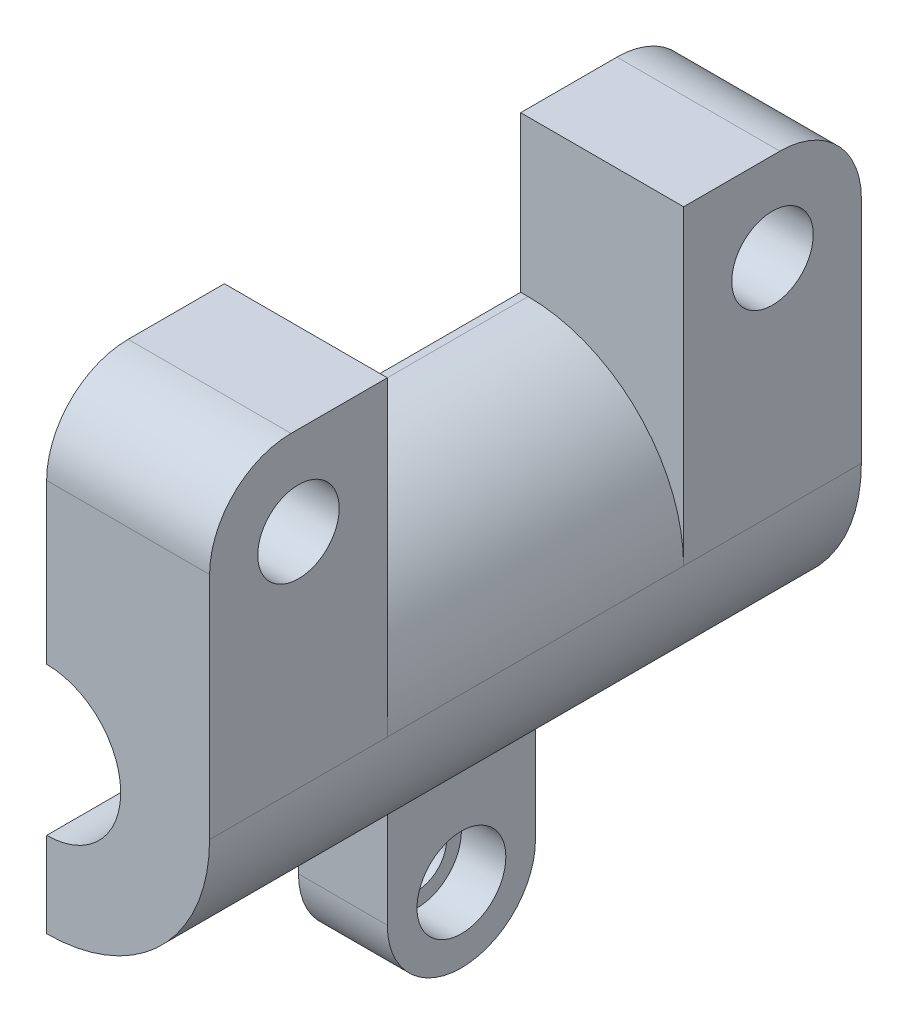
ISO-10303-21;
HEADER;
FILE_DESCRIPTION(('STEP AP214'),'2;1');
FILE_NAME('part.step','',(''),(''),'','','');
FILE_SCHEMA(('AUTOMOTIVE_DESIGN { 1 0 10303 214 1 1 1 1 }'));
ENDSEC;
DATA;
#1=APPLICATION_CONTEXT('core data for automotive mechanical design processes');
#2=APPLICATION_PROTOCOL_DEFINITION('international standard','automotive_design',2000,#1);
#3=PRODUCT_CONTEXT('',#1,'mechanical');
#4=PRODUCT('Part','Part','',(#3));
#5=PRODUCT_RELATED_PRODUCT_CATEGORY('part','',(#4));
#6=PRODUCT_DEFINITION_FORMATION('','',#4);
#7=PRODUCT_DEFINITION_CONTEXT('part definition',#1,'design');
#8=PRODUCT_DEFINITION('design','',#6,#7);
#9=PRODUCT_DEFINITION_SHAPE('','',#8);
#10=(LENGTH_UNIT() NAMED_UNIT(*) SI_UNIT(.MILLI.,.METRE.));
#11=(NAMED_UNIT(*) PLANE_ANGLE_UNIT() SI_UNIT($,.RADIAN.));
#12=(NAMED_UNIT(*) SI_UNIT($,.STERADIAN.) SOLID_ANGLE_UNIT());
#13=UNCERTAINTY_MEASURE_WITH_UNIT(LENGTH_MEASURE(1.E-05),#10,'distance_accuracy_value','');
#14=(GEOMETRIC_REPRESENTATION_CONTEXT(3) GLOBAL_UNCERTAINTY_ASSIGNED_CONTEXT((#13)) GLOBAL_UNIT_ASSIGNED_CONTEXT((#10,
#11,#12)) REPRESENTATION_CONTEXT('',''));
#15=CARTESIAN_POINT('',(0.,0.,0.));
#16=DIRECTION('',(0.,0.,1.));
#17=DIRECTION('',(1.,0.,0.));
#18=AXIS2_PLACEMENT_3D('',#15,#16,#17);
#19=CARTESIAN_POINT('',(11.,0.,0.));
#20=DIRECTION('',(-1.,0.,0.));
#21=DIRECTION('',(0.,0.,1.));
#22=AXIS2_PLACEMENT_3D('',#19,#20,#21);
#23=PLANE('',#22);
#24=CARTESIAN_POINT('',(11.,10.,16.));
#25=DIRECTION('',(1.,0.,0.));
#26=DIRECTION('',(0.,0.,-1.));
#27=AXIS2_PLACEMENT_3D('',#24,#25,#26);
#28=CIRCLE('',#27,2.75);
#29=CARTESIAN_POINT('',(11.,10.,13.25));
#30=VERTEX_POINT('',#29);
#31=EDGE_CURVE('E450',#30,#30,#28,.T.);
#32=ORIENTED_EDGE('',*,*,#31,.F.);
#33=EDGE_LOOP('',(#32));
#34=FACE_BOUND('',#33,.T.);
#35=DIRECTION('',(0.,-1.,0.));
#36=VECTOR('',#35,1.);
#37=CARTESIAN_POINT('',(11.,-16.,22.));
#38=LINE('',#37,#36);
#39=CARTESIAN_POINT('',(11.,10.5,22.));
#40=VERTEX_POINT('',#39);
#41=CARTESIAN_POINT('',(11.,-5.,22.));
#42=VERTEX_POINT('',#41);
#43=EDGE_CURVE('E233',#40,#42,#38,.T.);
#44=ORIENTED_EDGE('',*,*,#43,.T.);
#45=DIRECTION('',(0.,0.,-1.));
#46=VECTOR('',#45,1.);
#47=CARTESIAN_POINT('',(11.,-5.,0.));
#48=LINE('',#47,#46);
#49=CARTESIAN_POINT('',(11.,-4.99999999999999,9.99999999999999));
#50=VERTEX_POINT('',#49);
#51=EDGE_CURVE('E320',#42,#50,#48,.T.);
#52=ORIENTED_EDGE('',*,*,#51,.T.);
#53=DIRECTION('',(0.,-1.,0.));
#54=VECTOR('',#53,1.);
#55=CARTESIAN_POINT('',(11.,16.,10.));
#56=LINE('',#55,#54);
#57=CARTESIAN_POINT('',(11.,16.,10.));
#58=VERTEX_POINT('',#57);
#59=EDGE_CURVE('E429',#58,#50,#56,.T.);
#60=ORIENTED_EDGE('',*,*,#59,.F.);
#61=DIRECTION('',(0.,0.,1.));
#62=VECTOR('',#61,1.);
#63=CARTESIAN_POINT('',(11.,16.,22.));
#64=LINE('',#63,#62);
#65=CARTESIAN_POINT('',(11.,16.,16.5));
#66=VERTEX_POINT('',#65);
#67=EDGE_CURVE('E222',#58,#66,#64,.T.);
#68=ORIENTED_EDGE('',*,*,#67,.T.);
#69=CARTESIAN_POINT('',(11.,10.5,16.5));
#70=DIRECTION('',(-1.,0.,0.));
#71=DIRECTION('',(0.,0.,1.));
#72=AXIS2_PLACEMENT_3D('',#69,#70,#71);
#73=CIRCLE('',#72,5.5);
#74=EDGE_CURVE('E266',#66,#40,#73,.F.);
#75=ORIENTED_EDGE('',*,*,#74,.T.);
#76=EDGE_LOOP('',(#44,#52,#60,#68,#75));
#77=FACE_BOUND('',#76,.T.);
#78=ADVANCED_FACE('F39',(#34,#77),#23,.F.);
#79=CARTESIAN_POINT('',(6.,-21.,0.));
#80=DIRECTION('',(-1.,0.,0.));
#81=DIRECTION('',(0.,0.,1.));
#82=AXIS2_PLACEMENT_3D('',#79,#80,#81);
#83=CYLINDRICAL_SURFACE('',#82,2.);
#84=CARTESIAN_POINT('',(0.,-21.,0.));
#85=DIRECTION('',(1.,0.,0.));
#86=DIRECTION('',(0.,0.,-1.));
#87=AXIS2_PLACEMENT_3D('',#84,#85,#86);
#88=CIRCLE('',#87,2.);
#89=CARTESIAN_POINT('',(0.,-21.,-2.));
#90=VERTEX_POINT('',#89);
#91=EDGE_CURVE('E302',#90,#90,#88,.T.);
#92=ORIENTED_EDGE('',*,*,#91,.F.);
#93=EDGE_LOOP('',(#92));
#94=FACE_BOUND('',#93,.T.);
#95=CARTESIAN_POINT('',(3.,-21.,0.));
#96=DIRECTION('',(1.,0.,0.));
#97=DIRECTION('',(0.,0.,-1.));
#98=AXIS2_PLACEMENT_3D('',#95,#96,#97);
#99=CIRCLE('',#98,2.);
#100=CARTESIAN_POINT('',(3.,-21.,-2.));
#101=VERTEX_POINT('',#100);
#102=EDGE_CURVE('E468',#101,#101,#99,.T.);
#103=ORIENTED_EDGE('',*,*,#102,.T.);
#104=EDGE_LOOP('',(#103));
#105=FACE_BOUND('',#104,.T.);
#106=ADVANCED_FACE('F476',(#94,#105),#83,.F.);
#107=CARTESIAN_POINT('',(11.,16.,22.));
#108=DIRECTION('',(0.,-1.,0.));
#109=DIRECTION('',(0.,0.,-1.));
#110=AXIS2_PLACEMENT_3D('',#107,#108,#109);
#111=PLANE('',#110);
#112=DIRECTION('',(0.,0.,1.));
#113=VECTOR('',#112,1.);
#114=CARTESIAN_POINT('',(0.,16.,22.));
#115=LINE('',#114,#113);
#116=CARTESIAN_POINT('',(0.,16.,10.));
#117=VERTEX_POINT('',#116);
#118=CARTESIAN_POINT('',(0.,16.,16.5));
#119=VERTEX_POINT('',#118);
#120=EDGE_CURVE('E350',#117,#119,#115,.T.);
#121=ORIENTED_EDGE('',*,*,#120,.T.);
#122=DIRECTION('',(-1.,0.,0.));
#123=VECTOR('',#122,1.);
#124=CARTESIAN_POINT('',(11.,16.,16.5));
#125=LINE('',#124,#123);
#126=EDGE_CURVE('E276',#119,#66,#125,.F.);
#127=ORIENTED_EDGE('',*,*,#126,.T.);
#128=ORIENTED_EDGE('',*,*,#67,.F.);
#129=DIRECTION('',(1.,0.,0.));
#130=VECTOR('',#129,1.);
#131=CARTESIAN_POINT('',(0.,16.,10.));
#132=LINE('',#131,#130);
#133=EDGE_CURVE('E420',#117,#58,#132,.T.);
#134=ORIENTED_EDGE('',*,*,#133,.F.);
#135=EDGE_LOOP('',(#121,#127,#128,#134));
#136=FACE_BOUND('',#135,.T.);
#137=ADVANCED_FACE('F512',(#136),#111,.F.);
#138=CARTESIAN_POINT('',(0.,0.,0.));
#139=DIRECTION('',(-1.,0.,0.));
#140=DIRECTION('',(0.,0.,1.));
#141=AXIS2_PLACEMENT_3D('',#138,#139,#140);
#142=PLANE('',#141);
#143=DIRECTION('',(0.,1.,0.));
#144=VECTOR('',#143,1.);
#145=CARTESIAN_POINT('',(0.,-16.,-5.));
#146=LINE('',#145,#144);
#147=CARTESIAN_POINT('',(0.,-21.,-5.));
#148=VERTEX_POINT('',#147);
#149=CARTESIAN_POINT('',(0.,-16.,-5.));
#150=VERTEX_POINT('',#149);
#151=EDGE_CURVE('E211',#148,#150,#146,.T.);
#152=ORIENTED_EDGE('',*,*,#151,.F.);
#153=CARTESIAN_POINT('',(0.,-21.,0.));
#154=DIRECTION('',(-1.,0.,0.));
#155=DIRECTION('',(0.,0.,1.));
#156=AXIS2_PLACEMENT_3D('',#153,#154,#155);
#157=CIRCLE('',#156,5.);
#158=CARTESIAN_POINT('',(0.,-26.,0.));
#159=VERTEX_POINT('',#158);
#160=EDGE_CURVE('E285',#148,#159,#157,.T.);
#161=ORIENTED_EDGE('',*,*,#160,.T.);
#162=CARTESIAN_POINT('',(0.,-21.,0.));
#163=DIRECTION('',(-1.,0.,0.));
#164=DIRECTION('',(0.,0.,1.));
#165=AXIS2_PLACEMENT_3D('',#162,#163,#164);
#166=CIRCLE('',#165,5.);
#167=CARTESIAN_POINT('',(0.,-21.,5.));
#168=VERTEX_POINT('',#167);
#169=EDGE_CURVE('E209',#159,#168,#166,.T.);
#170=ORIENTED_EDGE('',*,*,#169,.T.);
#171=DIRECTION('',(0.,-1.,0.));
#172=VECTOR('',#171,1.);
#173=CARTESIAN_POINT('',(0.,-16.,5.));
#174=LINE('',#173,#172);
#175=CARTESIAN_POINT('',(0.,-16.,5.));
#176=VERTEX_POINT('',#175);
#177=EDGE_CURVE('E195',#176,#168,#174,.T.);
#178=ORIENTED_EDGE('',*,*,#177,.F.);
#179=DIRECTION('',(0.,0.,-1.));
#180=VECTOR('',#179,1.);
#181=CARTESIAN_POINT('',(0.,-16.,22.));
#182=LINE('',#181,#180);
#183=CARTESIAN_POINT('',(0.,-16.,22.));
#184=VERTEX_POINT('',#183);
#185=EDGE_CURVE('E206',#184,#176,#182,.T.);
#186=ORIENTED_EDGE('',*,*,#185,.F.);
#187=DIRECTION('',(0.,-1.,0.));
#188=VECTOR('',#187,1.);
#189=CARTESIAN_POINT('',(0.,-16.,22.));
#190=LINE('',#189,#188);
#191=CARTESIAN_POINT('',(0.,-10.25,22.));
#192=VERTEX_POINT('',#191);
#193=EDGE_CURVE('E362',#192,#184,#190,.T.);
#194=ORIENTED_EDGE('',*,*,#193,.F.);
#195=DIRECTION('',(0.,0.,1.));
#196=VECTOR('',#195,1.);
#197=CARTESIAN_POINT('',(0.,-10.25,-22.));
#198=LINE('',#197,#196);
#199=CARTESIAN_POINT('',(0.,-10.25,12.25));
#200=VERTEX_POINT('',#199);
#201=EDGE_CURVE('E249',#200,#192,#198,.T.);
#202=ORIENTED_EDGE('',*,*,#201,.F.);
#203=DIRECTION('',(0.,1.,0.));
#204=VECTOR('',#203,1.);
#205=CARTESIAN_POINT('',(0.,-13.,12.25));
#206=LINE('',#205,#204);
#207=CARTESIAN_POINT('',(0.,-13.,12.25));
#208=VERTEX_POINT('',#207);
#209=EDGE_CURVE('E571',#208,#200,#206,.T.);
#210=ORIENTED_EDGE('',*,*,#209,.F.);
#211=DIRECTION('',(0.,0.,1.));
#212=VECTOR('',#211,1.);
#213=CARTESIAN_POINT('',(0.,-13.,-12.25));
#214=LINE('',#213,#212);
#215=CARTESIAN_POINT('',(0.,-13.,-12.25));
#216=VERTEX_POINT('',#215);
#217=EDGE_CURVE('E567',#216,#208,#214,.T.);
#218=ORIENTED_EDGE('',*,*,#217,.F.);
#219=DIRECTION('',(0.,1.,0.));
#220=VECTOR('',#219,1.);
#221=CARTESIAN_POINT('',(0.,-13.,-12.25));
#222=LINE('',#221,#220);
#223=CARTESIAN_POINT('',(0.,-10.25,-12.25));
#224=VERTEX_POINT('',#223);
#225=EDGE_CURVE('E358',#216,#224,#222,.T.);
#226=ORIENTED_EDGE('',*,*,#225,.T.);
#227=CARTESIAN_POINT('',(0.,-10.25,-22.));
#228=VERTEX_POINT('',#227);
#229=EDGE_CURVE('E346',#228,#224,#198,.T.);
#230=ORIENTED_EDGE('',*,*,#229,.F.);
#231=DIRECTION('',(0.,1.,0.));
#232=VECTOR('',#231,1.);
#233=CARTESIAN_POINT('',(0.,-16.,-22.));
#234=LINE('',#233,#232);
#235=CARTESIAN_POINT('',(0.,-16.,-22.));
#236=VERTEX_POINT('',#235);
#237=EDGE_CURVE('E344',#236,#228,#234,.T.);
#238=ORIENTED_EDGE('',*,*,#237,.F.);
#239=EDGE_CURVE('E218',#150,#236,#182,.T.);
#240=ORIENTED_EDGE('',*,*,#239,.F.);
#241=EDGE_LOOP('',(#152,#161,#170,#178,#186,#194,#202,#210,#218,#226,#230,#238,#240));
#242=FACE_BOUND('',#241,.T.);
#243=ORIENTED_EDGE('',*,*,#91,.T.);
#244=EDGE_LOOP('',(#243));
#245=FACE_BOUND('',#244,.T.);
#246=ADVANCED_FACE('F203',(#242,#245),#142,.T.);
#247=CARTESIAN_POINT('',(0.,10.,16.));
#248=DIRECTION('',(1.,0.,0.));
#249=DIRECTION('',(0.,0.,-1.));
#250=AXIS2_PLACEMENT_3D('',#247,#248,#249);
#251=CIRCLE('',#250,2.75);
#252=CARTESIAN_POINT('',(0.,10.,13.25));
#253=VERTEX_POINT('',#252);
#254=EDGE_CURVE('E386',#253,#253,#251,.T.);
#255=ORIENTED_EDGE('',*,*,#254,.T.);
#256=EDGE_LOOP('',(#255));
#257=FACE_BOUND('',#256,.T.);
#258=CARTESIAN_POINT('',(0.,10.,-16.));
#259=DIRECTION('',(1.,0.,0.));
#260=DIRECTION('',(0.,0.,-1.));
#261=AXIS2_PLACEMENT_3D('',#258,#259,#260);
#262=CIRCLE('',#261,2.75);
#263=CARTESIAN_POINT('',(0.,10.,-18.75));
#264=VERTEX_POINT('',#263);
#265=EDGE_CURVE('E446',#264,#264,#262,.T.);
#266=ORIENTED_EDGE('',*,*,#265,.T.);
#267=EDGE_LOOP('',(#266));
#268=FACE_BOUND('',#267,.T.);
#269=CARTESIAN_POINT('',(0.,16.,-16.5));
#270=VERTEX_POINT('',#269);
#271=CARTESIAN_POINT('',(0.,16.,-10.));
#272=VERTEX_POINT('',#271);
#273=EDGE_CURVE('E356',#270,#272,#115,.T.);
#274=ORIENTED_EDGE('',*,*,#273,.F.);
#275=CARTESIAN_POINT('',(0.,10.5,-16.5));
#276=DIRECTION('',(-1.,0.,0.));
#277=DIRECTION('',(0.,0.,1.));
#278=AXIS2_PLACEMENT_3D('',#275,#276,#277);
#279=CIRCLE('',#278,5.5);
#280=CARTESIAN_POINT('',(0.,10.5,-22.));
#281=VERTEX_POINT('',#280);
#282=EDGE_CURVE('E259',#270,#281,#279,.T.);
#283=ORIENTED_EDGE('',*,*,#282,.T.);
#284=CARTESIAN_POINT('',(0.,-0.249999999999999,-22.));
#285=VERTEX_POINT('',#284);
#286=EDGE_CURVE('E351',#285,#281,#234,.T.);
#287=ORIENTED_EDGE('',*,*,#286,.F.);
#288=DIRECTION('',(0.,0.,1.));
#289=VECTOR('',#288,1.);
#290=CARTESIAN_POINT('',(0.,-0.249999999999999,-22.));
#291=LINE('',#290,#289);
#292=CARTESIAN_POINT('',(0.,-0.249999999999999,-12.25));
#293=VERTEX_POINT('',#292);
#294=EDGE_CURVE('E395',#293,#285,#291,.F.);
#295=ORIENTED_EDGE('',*,*,#294,.F.);
#296=CARTESIAN_POINT('',(0.,2.5,-12.25));
#297=VERTEX_POINT('',#296);
#298=EDGE_CURVE('E566',#293,#297,#222,.T.);
#299=ORIENTED_EDGE('',*,*,#298,.T.);
#300=DIRECTION('',(0.,0.,1.));
#301=VECTOR('',#300,1.);
#302=CARTESIAN_POINT('',(0.,2.5,-12.25));
#303=LINE('',#302,#301);
#304=CARTESIAN_POINT('',(0.,2.5,12.25));
#305=VERTEX_POINT('',#304);
#306=EDGE_CURVE('E248',#297,#305,#303,.T.);
#307=ORIENTED_EDGE('',*,*,#306,.T.);
#308=CARTESIAN_POINT('',(0.,-0.249999999999999,12.25));
#309=VERTEX_POINT('',#308);
#310=EDGE_CURVE('E391',#309,#305,#206,.T.);
#311=ORIENTED_EDGE('',*,*,#310,.F.);
#312=CARTESIAN_POINT('',(0.,-0.249999999999999,22.));
#313=VERTEX_POINT('',#312);
#314=EDGE_CURVE('E381',#313,#309,#291,.F.);
#315=ORIENTED_EDGE('',*,*,#314,.F.);
#316=CARTESIAN_POINT('',(0.,10.5,22.));
#317=VERTEX_POINT('',#316);
#318=EDGE_CURVE('E225',#317,#313,#190,.T.);
#319=ORIENTED_EDGE('',*,*,#318,.F.);
#320=CARTESIAN_POINT('',(0.,10.5,16.5));
#321=DIRECTION('',(-1.,0.,0.));
#322=DIRECTION('',(0.,0.,1.));
#323=AXIS2_PLACEMENT_3D('',#320,#321,#322);
#324=CIRCLE('',#323,5.5);
#325=EDGE_CURVE('E256',#317,#119,#324,.T.);
#326=ORIENTED_EDGE('',*,*,#325,.T.);
#327=ORIENTED_EDGE('',*,*,#120,.F.);
#328=DIRECTION('',(0.,-1.,0.));
#329=VECTOR('',#328,1.);
#330=CARTESIAN_POINT('',(0.,16.,10.));
#331=LINE('',#330,#329);
#332=CARTESIAN_POINT('',(0.,5.5,10.));
#333=VERTEX_POINT('',#332);
#334=EDGE_CURVE('E428',#117,#333,#331,.T.);
#335=ORIENTED_EDGE('',*,*,#334,.T.);
#336=DIRECTION('',(0.,0.,-1.));
#337=VECTOR('',#336,1.);
#338=CARTESIAN_POINT('',(0.,5.5,10.));
#339=LINE('',#338,#337);
#340=CARTESIAN_POINT('',(0.,5.5,-10.));
#341=VERTEX_POINT('',#340);
#342=EDGE_CURVE('E436',#333,#341,#339,.T.);
#343=ORIENTED_EDGE('',*,*,#342,.T.);
#344=DIRECTION('',(0.,1.,0.));
#345=VECTOR('',#344,1.);
#346=CARTESIAN_POINT('',(0.,16.,-10.));
#347=LINE('',#346,#345);
#348=EDGE_CURVE('E413',#341,#272,#347,.T.);
#349=ORIENTED_EDGE('',*,*,#348,.T.);
#350=EDGE_LOOP('',(#274,#283,#287,#295,#299,#307,#311,#315,#319,#326,#327,#335,#343,#349));
#351=FACE_BOUND('',#350,.T.);
#352=ADVANCED_FACE('F389',(#257,#268,#351),#142,.T.);
#353=CARTESIAN_POINT('',(11.,-16.,-22.));
#354=DIRECTION('',(0.,0.,1.));
#355=DIRECTION('',(1.,0.,0.));
#356=AXIS2_PLACEMENT_3D('',#353,#354,#355);
#357=PLANE('',#356);
#358=DIRECTION('',(0.,1.,0.));
#359=VECTOR('',#358,1.);
#360=CARTESIAN_POINT('',(11.,-16.,-22.));
#361=LINE('',#360,#359);
#362=CARTESIAN_POINT('',(11.,-5.,-22.));
#363=VERTEX_POINT('',#362);
#364=CARTESIAN_POINT('',(11.,10.5,-22.));
#365=VERTEX_POINT('',#364);
#366=EDGE_CURVE('E217',#363,#365,#361,.T.);
#367=ORIENTED_EDGE('',*,*,#366,.F.);
#368=CARTESIAN_POINT('',(0.,-5.,-22.));
#369=DIRECTION('',(0.,0.,1.));
#370=DIRECTION('',(1.,0.,0.));
#371=AXIS2_PLACEMENT_3D('',#368,#369,#370);
#372=CIRCLE('',#371,11.);
#373=EDGE_CURVE('E324',#363,#236,#372,.F.);
#374=ORIENTED_EDGE('',*,*,#373,.T.);
#375=ORIENTED_EDGE('',*,*,#237,.T.);
#376=CARTESIAN_POINT('',(0.,-5.25,-22.));
#377=DIRECTION('',(0.,0.,1.));
#378=DIRECTION('',(1.,0.,0.));
#379=AXIS2_PLACEMENT_3D('',#376,#377,#378);
#380=CIRCLE('',#379,5.);
#381=EDGE_CURVE('E385',#228,#285,#380,.T.);
#382=ORIENTED_EDGE('',*,*,#381,.T.);
#383=ORIENTED_EDGE('',*,*,#286,.T.);
#384=DIRECTION('',(-1.,0.,0.));
#385=VECTOR('',#384,1.);
#386=CARTESIAN_POINT('',(11.,10.5,-22.));
#387=LINE('',#386,#385);
#388=EDGE_CURVE('E262',#281,#365,#387,.F.);
#389=ORIENTED_EDGE('',*,*,#388,.T.);
#390=EDGE_LOOP('',(#367,#374,#375,#382,#383,#389));
#391=FACE_BOUND('',#390,.T.);
#392=ADVANCED_FACE('F542',(#391),#357,.F.);
#393=CARTESIAN_POINT('',(11.,16.,-16.5));
#394=VERTEX_POINT('',#393);
#395=CARTESIAN_POINT('',(11.,16.,-10.));
#396=VERTEX_POINT('',#395);
#397=EDGE_CURVE('E534',#394,#396,#64,.T.);
#398=ORIENTED_EDGE('',*,*,#397,.F.);
#399=DIRECTION('',(-1.,0.,0.));
#400=VECTOR('',#399,1.);
#401=CARTESIAN_POINT('',(11.,16.,-16.5));
#402=LINE('',#401,#400);
#403=EDGE_CURVE('E252',#394,#270,#402,.T.);
#404=ORIENTED_EDGE('',*,*,#403,.T.);
#405=ORIENTED_EDGE('',*,*,#273,.T.);
#406=DIRECTION('',(1.,0.,0.));
#407=VECTOR('',#406,1.);
#408=CARTESIAN_POINT('',(0.,16.,-10.));
#409=LINE('',#408,#407);
#410=EDGE_CURVE('E417',#272,#396,#409,.T.);
#411=ORIENTED_EDGE('',*,*,#410,.T.);
#412=EDGE_LOOP('',(#398,#404,#405,#411));
#413=FACE_BOUND('',#412,.T.);
#414=ADVANCED_FACE('F527',(#413),#111,.F.);
#415=CARTESIAN_POINT('',(11.,-16.,22.));
#416=DIRECTION('',(0.,0.,-1.));
#417=DIRECTION('',(-1.,0.,0.));
#418=AXIS2_PLACEMENT_3D('',#415,#416,#417);
#419=PLANE('',#418);
#420=ORIENTED_EDGE('',*,*,#193,.T.);
#421=CARTESIAN_POINT('',(0.,-5.,22.));
#422=DIRECTION('',(0.,0.,-1.));
#423=DIRECTION('',(-1.,0.,0.));
#424=AXIS2_PLACEMENT_3D('',#421,#422,#423);
#425=CIRCLE('',#424,11.);
#426=EDGE_CURVE('E215',#184,#42,#425,.F.);
#427=ORIENTED_EDGE('',*,*,#426,.T.);
#428=ORIENTED_EDGE('',*,*,#43,.F.);
#429=DIRECTION('',(-1.,0.,0.));
#430=VECTOR('',#429,1.);
#431=CARTESIAN_POINT('',(11.,10.5,22.));
#432=LINE('',#431,#430);
#433=EDGE_CURVE('E272',#40,#317,#432,.T.);
#434=ORIENTED_EDGE('',*,*,#433,.T.);
#435=ORIENTED_EDGE('',*,*,#318,.T.);
#436=CARTESIAN_POINT('',(0.,-5.25,22.));
#437=DIRECTION('',(0.,0.,1.));
#438=DIRECTION('',(1.,0.,0.));
#439=AXIS2_PLACEMENT_3D('',#436,#437,#438);
#440=CIRCLE('',#439,5.);
#441=EDGE_CURVE('E374',#192,#313,#440,.T.);
#442=ORIENTED_EDGE('',*,*,#441,.F.);
#443=EDGE_LOOP('',(#420,#427,#428,#434,#435,#442));
#444=FACE_BOUND('',#443,.T.);
#445=ADVANCED_FACE('F373',(#444),#419,.F.);
#446=CARTESIAN_POINT('',(11.,10.,-16.));
#447=DIRECTION('',(1.,0.,0.));
#448=DIRECTION('',(0.,0.,-1.));
#449=AXIS2_PLACEMENT_3D('',#446,#447,#448);
#450=CIRCLE('',#449,2.75);
#451=CARTESIAN_POINT('',(11.,10.,-18.75));
#452=VERTEX_POINT('',#451);
#453=EDGE_CURVE('E423',#452,#452,#450,.T.);
#454=ORIENTED_EDGE('',*,*,#453,.F.);
#455=EDGE_LOOP('',(#454));
#456=FACE_BOUND('',#455,.T.);
#457=DIRECTION('',(0.,1.,0.));
#458=VECTOR('',#457,1.);
#459=CARTESIAN_POINT('',(11.,16.,-10.));
#460=LINE('',#459,#458);
#461=CARTESIAN_POINT('',(11.,-5.,-10.));
#462=VERTEX_POINT('',#461);
#463=EDGE_CURVE('E424',#462,#396,#460,.T.);
#464=ORIENTED_EDGE('',*,*,#463,.F.);
#465=DIRECTION('',(0.,0.,-1.));
#466=VECTOR('',#465,1.);
#467=CARTESIAN_POINT('',(11.,-5.,0.));
#468=LINE('',#467,#466);
#469=EDGE_CURVE('E317',#462,#363,#468,.T.);
#470=ORIENTED_EDGE('',*,*,#469,.T.);
#471=ORIENTED_EDGE('',*,*,#366,.T.);
#472=CARTESIAN_POINT('',(11.,10.5,-16.5));
#473=DIRECTION('',(-1.,0.,0.));
#474=DIRECTION('',(0.,0.,1.));
#475=AXIS2_PLACEMENT_3D('',#472,#473,#474);
#476=CIRCLE('',#475,5.5);
#477=EDGE_CURVE('E269',#365,#394,#476,.F.);
#478=ORIENTED_EDGE('',*,*,#477,.T.);
#479=ORIENTED_EDGE('',*,*,#397,.T.);
#480=EDGE_LOOP('',(#464,#470,#471,#478,#479));
#481=FACE_BOUND('',#480,.T.);
#482=ADVANCED_FACE('F508',(#456,#481),#23,.F.);
#483=CARTESIAN_POINT('',(7.75,-13.,12.25));
#484=DIRECTION('',(0.,0.,1.));
#485=DIRECTION('',(0.,-1.,0.));
#486=AXIS2_PLACEMENT_3D('',#483,#484,#485);
#487=PLANE('',#486);
#488=ORIENTED_EDGE('',*,*,#209,.T.);
#489=CARTESIAN_POINT('',(0.,-5.25,12.25));
#490=DIRECTION('',(0.,0.,1.));
#491=DIRECTION('',(0.,-1.,0.));
#492=AXIS2_PLACEMENT_3D('',#489,#490,#491);
#493=CIRCLE('',#492,5.);
#494=EDGE_CURVE('E393',#200,#309,#493,.T.);
#495=ORIENTED_EDGE('',*,*,#494,.T.);
#496=ORIENTED_EDGE('',*,*,#310,.T.);
#497=CARTESIAN_POINT('',(0.,-5.25,12.25));
#498=DIRECTION('',(0.,0.,1.));
#499=DIRECTION('',(0.,-1.,0.));
#500=AXIS2_PLACEMENT_3D('',#497,#498,#499);
#501=CIRCLE('',#500,7.75);
#502=CARTESIAN_POINT('',(7.75,-5.25,12.25));
#503=VERTEX_POINT('',#502);
#504=EDGE_CURVE('E232',#305,#503,#501,.F.);
#505=ORIENTED_EDGE('',*,*,#504,.T.);
#506=CARTESIAN_POINT('',(0.,-5.25,12.25));
#507=DIRECTION('',(0.,0.,1.));
#508=DIRECTION('',(0.,-1.,0.));
#509=AXIS2_PLACEMENT_3D('',#506,#507,#508);
#510=CIRCLE('',#509,7.75);
#511=EDGE_CURVE('E229',#503,#208,#510,.F.);
#512=ORIENTED_EDGE('',*,*,#511,.T.);
#513=EDGE_LOOP('',(#488,#495,#496,#505,#512));
#514=FACE_BOUND('',#513,.T.);
#515=ADVANCED_FACE('F519',(#514),#487,.F.);
#516=CARTESIAN_POINT('',(7.75,-13.,-12.25));
#517=DIRECTION('',(0.,0.,1.));
#518=DIRECTION('',(1.,0.,0.));
#519=AXIS2_PLACEMENT_3D('',#516,#517,#518);
#520=PLANE('',#519);
#521=CARTESIAN_POINT('',(0.,-5.25,-12.25));
#522=DIRECTION('',(0.,0.,1.));
#523=DIRECTION('',(1.,0.,0.));
#524=AXIS2_PLACEMENT_3D('',#521,#522,#523);
#525=CIRCLE('',#524,5.);
#526=EDGE_CURVE('E243',#224,#293,#525,.T.);
#527=ORIENTED_EDGE('',*,*,#526,.F.);
#528=ORIENTED_EDGE('',*,*,#225,.F.);
#529=CARTESIAN_POINT('',(0.,-5.25,-12.25));
#530=DIRECTION('',(0.,0.,1.));
#531=DIRECTION('',(1.,0.,0.));
#532=AXIS2_PLACEMENT_3D('',#529,#530,#531);
#533=CIRCLE('',#532,7.75);
#534=CARTESIAN_POINT('',(7.75,-5.25,-12.25));
#535=VERTEX_POINT('',#534);
#536=EDGE_CURVE('E236',#216,#535,#533,.T.);
#537=ORIENTED_EDGE('',*,*,#536,.T.);
#538=CARTESIAN_POINT('',(0.,-5.25,-12.25));
#539=DIRECTION('',(0.,0.,1.));
#540=DIRECTION('',(1.,0.,0.));
#541=AXIS2_PLACEMENT_3D('',#538,#539,#540);
#542=CIRCLE('',#541,7.75);
#543=EDGE_CURVE('E239',#535,#297,#542,.T.);
#544=ORIENTED_EDGE('',*,*,#543,.T.);
#545=ORIENTED_EDGE('',*,*,#298,.F.);
#546=EDGE_LOOP('',(#527,#528,#537,#544,#545));
#547=FACE_BOUND('',#546,.T.);
#548=ADVANCED_FACE('F525',(#547),#520,.T.);
#549=CARTESIAN_POINT('',(0.,-5.25,0.));
#550=DIRECTION('',(0.,0.,1.));
#551=DIRECTION('',(0.,-1.,0.));
#552=AXIS2_PLACEMENT_3D('',#549,#550,#551);
#553=CYLINDRICAL_SURFACE('',#552,7.75);
#554=DIRECTION('',(0.,0.,1.));
#555=VECTOR('',#554,1.);
#556=CARTESIAN_POINT('',(7.75,-5.25,0.));
#557=LINE('',#556,#555);
#558=EDGE_CURVE('E244',#535,#503,#557,.T.);
#559=ORIENTED_EDGE('',*,*,#558,.F.);
#560=ORIENTED_EDGE('',*,*,#536,.F.);
#561=ORIENTED_EDGE('',*,*,#217,.T.);
#562=ORIENTED_EDGE('',*,*,#511,.F.);
#563=EDGE_LOOP('',(#559,#560,#561,#562));
#564=FACE_BOUND('',#563,.T.);
#565=ADVANCED_FACE('F586',(#564),#553,.F.);
#566=CARTESIAN_POINT('',(0.,-5.25,-12.25));
#567=DIRECTION('',(0.,0.,-1.));
#568=DIRECTION('',(0.,1.,0.));
#569=AXIS2_PLACEMENT_3D('',#566,#567,#568);
#570=CYLINDRICAL_SURFACE('',#569,7.75);
#571=ORIENTED_EDGE('',*,*,#543,.F.);
#572=ORIENTED_EDGE('',*,*,#558,.T.);
#573=ORIENTED_EDGE('',*,*,#504,.F.);
#574=ORIENTED_EDGE('',*,*,#306,.F.);
#575=EDGE_LOOP('',(#571,#572,#573,#574));
#576=FACE_BOUND('',#575,.T.);
#577=ADVANCED_FACE('F582',(#576),#570,.F.);
#578=CARTESIAN_POINT('',(0.,-5.25,-22.));
#579=DIRECTION('',(0.,0.,1.));
#580=DIRECTION('',(1.,0.,0.));
#581=AXIS2_PLACEMENT_3D('',#578,#579,#580);
#582=CYLINDRICAL_SURFACE('',#581,5.);
#583=ORIENTED_EDGE('',*,*,#229,.T.);
#584=ORIENTED_EDGE('',*,*,#526,.T.);
#585=ORIENTED_EDGE('',*,*,#294,.T.);
#586=ORIENTED_EDGE('',*,*,#381,.F.);
#587=EDGE_LOOP('',(#583,#584,#585,#586));
#588=FACE_BOUND('',#587,.T.);
#589=ADVANCED_FACE('F592',(#588),#582,.F.);
#590=ORIENTED_EDGE('',*,*,#201,.T.);
#591=ORIENTED_EDGE('',*,*,#441,.T.);
#592=ORIENTED_EDGE('',*,*,#314,.T.);
#593=ORIENTED_EDGE('',*,*,#494,.F.);
#594=EDGE_LOOP('',(#590,#591,#592,#593));
#595=FACE_BOUND('',#594,.T.);
#596=ADVANCED_FACE('F380',(#595),#582,.F.);
#597=CARTESIAN_POINT('',(0.,16.,10.));
#598=DIRECTION('',(0.,0.,1.));
#599=DIRECTION('',(0.,-1.,0.));
#600=AXIS2_PLACEMENT_3D('',#597,#598,#599);
#601=PLANE('',#600);
#602=ORIENTED_EDGE('',*,*,#59,.T.);
#603=CARTESIAN_POINT('',(0.499999999999999,-5.,9.99999999999999));
#604=DIRECTION('',(0.,0.,1.));
#605=DIRECTION('',(0.,-1.,0.));
#606=AXIS2_PLACEMENT_3D('',#603,#604,#605);
#607=CIRCLE('',#606,10.5);
#608=CARTESIAN_POINT('',(0.499999999999999,5.5,10.));
#609=VERTEX_POINT('',#608);
#610=EDGE_CURVE('E314',#50,#609,#607,.T.);
#611=ORIENTED_EDGE('',*,*,#610,.T.);
#612=DIRECTION('',(1.,0.,0.));
#613=VECTOR('',#612,1.);
#614=CARTESIAN_POINT('',(0.,5.5,10.));
#615=LINE('',#614,#613);
#616=EDGE_CURVE('E408',#333,#609,#615,.T.);
#617=ORIENTED_EDGE('',*,*,#616,.F.);
#618=ORIENTED_EDGE('',*,*,#334,.F.);
#619=ORIENTED_EDGE('',*,*,#133,.T.);
#620=EDGE_LOOP('',(#602,#611,#617,#618,#619));
#621=FACE_BOUND('',#620,.T.);
#622=ADVANCED_FACE('F553',(#621),#601,.F.);
#623=CARTESIAN_POINT('',(0.,16.,-10.));
#624=DIRECTION('',(0.,0.,-1.));
#625=DIRECTION('',(0.,1.,0.));
#626=AXIS2_PLACEMENT_3D('',#623,#624,#625);
#627=PLANE('',#626);
#628=ORIENTED_EDGE('',*,*,#463,.T.);
#629=ORIENTED_EDGE('',*,*,#410,.F.);
#630=ORIENTED_EDGE('',*,*,#348,.F.);
#631=DIRECTION('',(1.,0.,0.));
#632=VECTOR('',#631,1.);
#633=CARTESIAN_POINT('',(0.,5.5,-10.));
#634=LINE('',#633,#632);
#635=CARTESIAN_POINT('',(0.499999999999999,5.5,-10.));
#636=VERTEX_POINT('',#635);
#637=EDGE_CURVE('E412',#341,#636,#634,.T.);
#638=ORIENTED_EDGE('',*,*,#637,.T.);
#639=CARTESIAN_POINT('',(0.499999999999999,-5.,-10.));
#640=DIRECTION('',(0.,0.,-1.));
#641=DIRECTION('',(0.,1.,0.));
#642=AXIS2_PLACEMENT_3D('',#639,#640,#641);
#643=CIRCLE('',#642,10.5);
#644=EDGE_CURVE('E310',#636,#462,#643,.T.);
#645=ORIENTED_EDGE('',*,*,#644,.T.);
#646=EDGE_LOOP('',(#628,#629,#630,#638,#645));
#647=FACE_BOUND('',#646,.T.);
#648=ADVANCED_FACE('F537',(#647),#627,.F.);
#649=CARTESIAN_POINT('',(0.,5.5,10.));
#650=DIRECTION('',(0.,-1.,0.));
#651=DIRECTION('',(0.,0.,-1.));
#652=AXIS2_PLACEMENT_3D('',#649,#650,#651);
#653=PLANE('',#652);
#654=ORIENTED_EDGE('',*,*,#616,.T.);
#655=DIRECTION('',(0.,0.,-1.));
#656=VECTOR('',#655,1.);
#657=CARTESIAN_POINT('',(0.499999999999999,5.5,10.));
#658=LINE('',#657,#656);
#659=EDGE_CURVE('E297',#609,#636,#658,.T.);
#660=ORIENTED_EDGE('',*,*,#659,.T.);
#661=ORIENTED_EDGE('',*,*,#637,.F.);
#662=ORIENTED_EDGE('',*,*,#342,.F.);
#663=EDGE_LOOP('',(#654,#660,#661,#662));
#664=FACE_BOUND('',#663,.T.);
#665=ADVANCED_FACE('F551',(#664),#653,.F.);
#666=CARTESIAN_POINT('',(0.,10.,-16.));
#667=DIRECTION('',(1.,0.,0.));
#668=DIRECTION('',(0.,0.,-1.));
#669=AXIS2_PLACEMENT_3D('',#666,#667,#668);
#670=CYLINDRICAL_SURFACE('',#669,2.75);
#671=ORIENTED_EDGE('',*,*,#265,.F.);
#672=EDGE_LOOP('',(#671));
#673=FACE_BOUND('',#672,.T.);
#674=ORIENTED_EDGE('',*,*,#453,.T.);
#675=EDGE_LOOP('',(#674));
#676=FACE_BOUND('',#675,.T.);
#677=ADVANCED_FACE('F711',(#673,#676),#670,.F.);
#678=CARTESIAN_POINT('',(0.,10.,16.));
#679=DIRECTION('',(1.,0.,0.));
#680=DIRECTION('',(0.,0.,-1.));
#681=AXIS2_PLACEMENT_3D('',#678,#679,#680);
#682=CYLINDRICAL_SURFACE('',#681,2.75);
#683=ORIENTED_EDGE('',*,*,#254,.F.);
#684=EDGE_LOOP('',(#683));
#685=FACE_BOUND('',#684,.T.);
#686=ORIENTED_EDGE('',*,*,#31,.T.);
#687=EDGE_LOOP('',(#686));
#688=FACE_BOUND('',#687,.T.);
#689=ADVANCED_FACE('F614',(#685,#688),#682,.F.);
#690=CARTESIAN_POINT('',(11.,10.5,-16.5));
#691=DIRECTION('',(-1.,0.,0.));
#692=DIRECTION('',(0.,0.,1.));
#693=AXIS2_PLACEMENT_3D('',#690,#691,#692);
#694=CYLINDRICAL_SURFACE('',#693,5.5);
#695=ORIENTED_EDGE('',*,*,#477,.F.);
#696=ORIENTED_EDGE('',*,*,#388,.F.);
#697=ORIENTED_EDGE('',*,*,#282,.F.);
#698=ORIENTED_EDGE('',*,*,#403,.F.);
#699=EDGE_LOOP('',(#695,#696,#697,#698));
#700=FACE_BOUND('',#699,.T.);
#701=ADVANCED_FACE('F500',(#700),#694,.T.);
#702=CARTESIAN_POINT('',(11.,10.5,16.5));
#703=DIRECTION('',(-1.,0.,0.));
#704=DIRECTION('',(0.,0.,1.));
#705=AXIS2_PLACEMENT_3D('',#702,#703,#704);
#706=CYLINDRICAL_SURFACE('',#705,5.5);
#707=ORIENTED_EDGE('',*,*,#74,.F.);
#708=ORIENTED_EDGE('',*,*,#126,.F.);
#709=ORIENTED_EDGE('',*,*,#325,.F.);
#710=ORIENTED_EDGE('',*,*,#433,.F.);
#711=EDGE_LOOP('',(#707,#708,#709,#710));
#712=FACE_BOUND('',#711,.T.);
#713=ADVANCED_FACE('F493',(#712),#706,.T.);
#714=CARTESIAN_POINT('',(6.,0.,0.));
#715=DIRECTION('',(-1.,0.,0.));
#716=DIRECTION('',(0.,0.,1.));
#717=AXIS2_PLACEMENT_3D('',#714,#715,#716);
#718=PLANE('',#717);
#719=CARTESIAN_POINT('',(6.,-21.,0.));
#720=DIRECTION('',(1.,0.,0.));
#721=DIRECTION('',(0.,0.,-1.));
#722=AXIS2_PLACEMENT_3D('',#719,#720,#721);
#723=CIRCLE('',#722,3.);
#724=CARTESIAN_POINT('',(6.,-21.,-3.));
#725=VERTEX_POINT('',#724);
#726=EDGE_CURVE('E464',#725,#725,#723,.T.);
#727=ORIENTED_EDGE('',*,*,#726,.F.);
#728=EDGE_LOOP('',(#727));
#729=FACE_BOUND('',#728,.T.);
#730=CARTESIAN_POINT('',(6.,-21.,0.));
#731=DIRECTION('',(-1.,0.,0.));
#732=DIRECTION('',(0.,0.,1.));
#733=AXIS2_PLACEMENT_3D('',#730,#731,#732);
#734=CIRCLE('',#733,5.);
#735=CARTESIAN_POINT('',(6.,-21.,5.));
#736=VERTEX_POINT('',#735);
#737=CARTESIAN_POINT('',(6.,-26.,0.));
#738=VERTEX_POINT('',#737);
#739=EDGE_CURVE('E288',#736,#738,#734,.F.);
#740=ORIENTED_EDGE('',*,*,#739,.T.);
#741=CARTESIAN_POINT('',(6.,-21.,0.));
#742=DIRECTION('',(-1.,0.,0.));
#743=DIRECTION('',(0.,0.,1.));
#744=AXIS2_PLACEMENT_3D('',#741,#742,#743);
#745=CIRCLE('',#744,5.);
#746=CARTESIAN_POINT('',(6.,-21.,-5.));
#747=VERTEX_POINT('',#746);
#748=EDGE_CURVE('E291',#738,#747,#745,.F.);
#749=ORIENTED_EDGE('',*,*,#748,.T.);
#750=DIRECTION('',(0.,1.,0.));
#751=VECTOR('',#750,1.);
#752=CARTESIAN_POINT('',(6.,-16.,-5.));
#753=LINE('',#752,#751);
#754=CARTESIAN_POINT('',(6.,-14.2195444572929,-5.));
#755=VERTEX_POINT('',#754);
#756=EDGE_CURVE('E61',#747,#755,#753,.T.);
#757=ORIENTED_EDGE('',*,*,#756,.T.);
#758=DIRECTION('',(0.,0.,-1.));
#759=VECTOR('',#758,1.);
#760=CARTESIAN_POINT('',(6.,-14.2195444572929,-5.));
#761=LINE('',#760,#759);
#762=CARTESIAN_POINT('',(6.,-14.2195444572929,5.));
#763=VERTEX_POINT('',#762);
#764=EDGE_CURVE('E48',#755,#763,#761,.F.);
#765=ORIENTED_EDGE('',*,*,#764,.T.);
#766=DIRECTION('',(0.,-1.,0.));
#767=VECTOR('',#766,1.);
#768=CARTESIAN_POINT('',(6.,-16.,5.));
#769=LINE('',#768,#767);
#770=EDGE_CURVE('E54',#763,#736,#769,.T.);
#771=ORIENTED_EDGE('',*,*,#770,.T.);
#772=EDGE_LOOP('',(#740,#749,#757,#765,#771));
#773=FACE_BOUND('',#772,.T.);
#774=ADVANCED_FACE('F332',(#729,#773),#718,.F.);
#775=CARTESIAN_POINT('',(6.,-16.,-5.));
#776=DIRECTION('',(0.,0.,1.));
#777=DIRECTION('',(0.,-1.,0.));
#778=AXIS2_PLACEMENT_3D('',#775,#776,#777);
#779=PLANE('',#778);
#780=ORIENTED_EDGE('',*,*,#756,.F.);
#781=DIRECTION('',(-1.,0.,0.));
#782=VECTOR('',#781,1.);
#783=CARTESIAN_POINT('',(6.,-21.,-5.));
#784=LINE('',#783,#782);
#785=EDGE_CURVE('E279',#747,#148,#784,.T.);
#786=ORIENTED_EDGE('',*,*,#785,.T.);
#787=ORIENTED_EDGE('',*,*,#151,.T.);
#788=CARTESIAN_POINT('',(0.,-5.,-5.));
#789=DIRECTION('',(0.,0.,1.));
#790=DIRECTION('',(0.,-1.,0.));
#791=AXIS2_PLACEMENT_3D('',#788,#789,#790);
#792=CIRCLE('',#791,11.);
#793=EDGE_CURVE('E329',#150,#755,#792,.T.);
#794=ORIENTED_EDGE('',*,*,#793,.T.);
#795=EDGE_LOOP('',(#780,#786,#787,#794));
#796=FACE_BOUND('',#795,.T.);
#797=ADVANCED_FACE('F337',(#796),#779,.F.);
#798=CARTESIAN_POINT('',(6.,-16.,5.));
#799=DIRECTION('',(0.,0.,-1.));
#800=DIRECTION('',(-1.,0.,0.));
#801=AXIS2_PLACEMENT_3D('',#798,#799,#800);
#802=PLANE('',#801);
#803=ORIENTED_EDGE('',*,*,#177,.T.);
#804=DIRECTION('',(-1.,0.,0.));
#805=VECTOR('',#804,1.);
#806=CARTESIAN_POINT('',(6.,-21.,5.));
#807=LINE('',#806,#805);
#808=EDGE_CURVE('E294',#168,#736,#807,.F.);
#809=ORIENTED_EDGE('',*,*,#808,.T.);
#810=ORIENTED_EDGE('',*,*,#770,.F.);
#811=CARTESIAN_POINT('',(0.,-5.,5.));
#812=DIRECTION('',(0.,0.,-1.));
#813=DIRECTION('',(-1.,0.,0.));
#814=AXIS2_PLACEMENT_3D('',#811,#812,#813);
#815=CIRCLE('',#814,11.);
#816=EDGE_CURVE('E11',#763,#176,#815,.T.);
#817=ORIENTED_EDGE('',*,*,#816,.T.);
#818=EDGE_LOOP('',(#803,#809,#810,#817));
#819=FACE_BOUND('',#818,.T.);
#820=ADVANCED_FACE('F194',(#819),#802,.F.);
#821=CARTESIAN_POINT('',(6.,-21.,0.));
#822=DIRECTION('',(-1.,0.,0.));
#823=DIRECTION('',(0.,0.,1.));
#824=AXIS2_PLACEMENT_3D('',#821,#822,#823);
#825=CYLINDRICAL_SURFACE('',#824,5.);
#826=DIRECTION('',(-1.,0.,0.));
#827=VECTOR('',#826,1.);
#828=CARTESIAN_POINT('',(6.,-26.,0.));
#829=LINE('',#828,#827);
#830=EDGE_CURVE('E298',#738,#159,#829,.T.);
#831=ORIENTED_EDGE('',*,*,#830,.F.);
#832=ORIENTED_EDGE('',*,*,#739,.F.);
#833=ORIENTED_EDGE('',*,*,#808,.F.);
#834=ORIENTED_EDGE('',*,*,#169,.F.);
#835=EDGE_LOOP('',(#831,#832,#833,#834));
#836=FACE_BOUND('',#835,.T.);
#837=ADVANCED_FACE('F618',(#836),#825,.T.);
#838=CARTESIAN_POINT('',(6.,-21.,0.));
#839=DIRECTION('',(-1.,0.,0.));
#840=DIRECTION('',(0.,0.,1.));
#841=AXIS2_PLACEMENT_3D('',#838,#839,#840);
#842=CYLINDRICAL_SURFACE('',#841,5.);
#843=ORIENTED_EDGE('',*,*,#748,.F.);
#844=ORIENTED_EDGE('',*,*,#830,.T.);
#845=ORIENTED_EDGE('',*,*,#160,.F.);
#846=ORIENTED_EDGE('',*,*,#785,.F.);
#847=EDGE_LOOP('',(#843,#844,#845,#846));
#848=FACE_BOUND('',#847,.T.);
#849=ADVANCED_FACE('F488',(#848),#842,.T.);
#850=CARTESIAN_POINT('',(3.,-21.,0.));
#851=DIRECTION('',(1.,0.,0.));
#852=DIRECTION('',(0.,0.,-1.));
#853=AXIS2_PLACEMENT_3D('',#850,#851,#852);
#854=CYLINDRICAL_SURFACE('',#853,3.);
#855=CARTESIAN_POINT('',(3.,-21.,0.));
#856=DIRECTION('',(1.,0.,0.));
#857=DIRECTION('',(0.,0.,-1.));
#858=AXIS2_PLACEMENT_3D('',#855,#856,#857);
#859=CIRCLE('',#858,3.);
#860=CARTESIAN_POINT('',(3.,-21.,-3.));
#861=VERTEX_POINT('',#860);
#862=EDGE_CURVE('E303',#861,#861,#859,.T.);
#863=ORIENTED_EDGE('',*,*,#862,.F.);
#864=EDGE_LOOP('',(#863));
#865=FACE_BOUND('',#864,.T.);
#866=ORIENTED_EDGE('',*,*,#726,.T.);
#867=EDGE_LOOP('',(#866));
#868=FACE_BOUND('',#867,.T.);
#869=ADVANCED_FACE('F482',(#865,#868),#854,.F.);
#870=CARTESIAN_POINT('',(3.,-21.,0.));
#871=DIRECTION('',(1.,0.,0.));
#872=DIRECTION('',(0.,0.,-1.));
#873=AXIS2_PLACEMENT_3D('',#870,#871,#872);
#874=PLANE('',#873);
#875=ORIENTED_EDGE('',*,*,#102,.F.);
#876=EDGE_LOOP('',(#875));
#877=FACE_BOUND('',#876,.T.);
#878=ORIENTED_EDGE('',*,*,#862,.T.);
#879=EDGE_LOOP('',(#878));
#880=FACE_BOUND('',#879,.T.);
#881=ADVANCED_FACE('F478',(#877,#880),#874,.T.);
#882=CARTESIAN_POINT('',(0.499999999999999,-5.,10.));
#883=DIRECTION('',(0.,0.,-1.));
#884=DIRECTION('',(-1.,0.,0.));
#885=AXIS2_PLACEMENT_3D('',#882,#883,#884);
#886=CYLINDRICAL_SURFACE('',#885,10.5);
#887=ORIENTED_EDGE('',*,*,#610,.F.);
#888=DIRECTION('',(0.,0.,-1.));
#889=VECTOR('',#888,1.);
#890=CARTESIAN_POINT('',(11.,-5.,0.));
#891=LINE('',#890,#889);
#892=EDGE_CURVE('E307',#462,#50,#891,.F.);
#893=ORIENTED_EDGE('',*,*,#892,.F.);
#894=ORIENTED_EDGE('',*,*,#644,.F.);
#895=ORIENTED_EDGE('',*,*,#659,.F.);
#896=EDGE_LOOP('',(#887,#893,#894,#895));
#897=FACE_BOUND('',#896,.T.);
#898=ADVANCED_FACE('F481',(#897),#886,.T.);
#899=CARTESIAN_POINT('',(0.,-5.,0.));
#900=DIRECTION('',(0.,0.,-1.));
#901=DIRECTION('',(-1.,0.,0.));
#902=AXIS2_PLACEMENT_3D('',#899,#900,#901);
#903=CYLINDRICAL_SURFACE('',#902,11.);
#904=ORIENTED_EDGE('',*,*,#793,.F.);
#905=ORIENTED_EDGE('',*,*,#239,.T.);
#906=ORIENTED_EDGE('',*,*,#373,.F.);
#907=ORIENTED_EDGE('',*,*,#469,.F.);
#908=ORIENTED_EDGE('',*,*,#892,.T.);
#909=ORIENTED_EDGE('',*,*,#51,.F.);
#910=ORIENTED_EDGE('',*,*,#426,.F.);
#911=ORIENTED_EDGE('',*,*,#185,.T.);
#912=ORIENTED_EDGE('',*,*,#816,.F.);
#913=ORIENTED_EDGE('',*,*,#764,.F.);
#914=EDGE_LOOP('',(#904,#905,#906,#907,#908,#909,#910,#911,#912,#913));
#915=FACE_BOUND('',#914,.T.);
#916=ADVANCED_FACE('F41',(#915),#903,.T.);
#917=CLOSED_SHELL('',(#78,#106,#137,#246,#352,#392,#414,#445,#482,#515,#548,#565,#577,#589,#596,
#622,#648,#665,#677,#689,#701,#713,#774,#797,#820,#837,#849,#869,#881,#898,#916));
#918=MANIFOLD_SOLID_BREP('B2',#917);
#919=ADVANCED_BREP_SHAPE_REPRESENTATION('',(#18,#918),#14);
#920=SHAPE_DEFINITION_REPRESENTATION(#9,#919);
ENDSEC;
END-ISO-10303-21;
